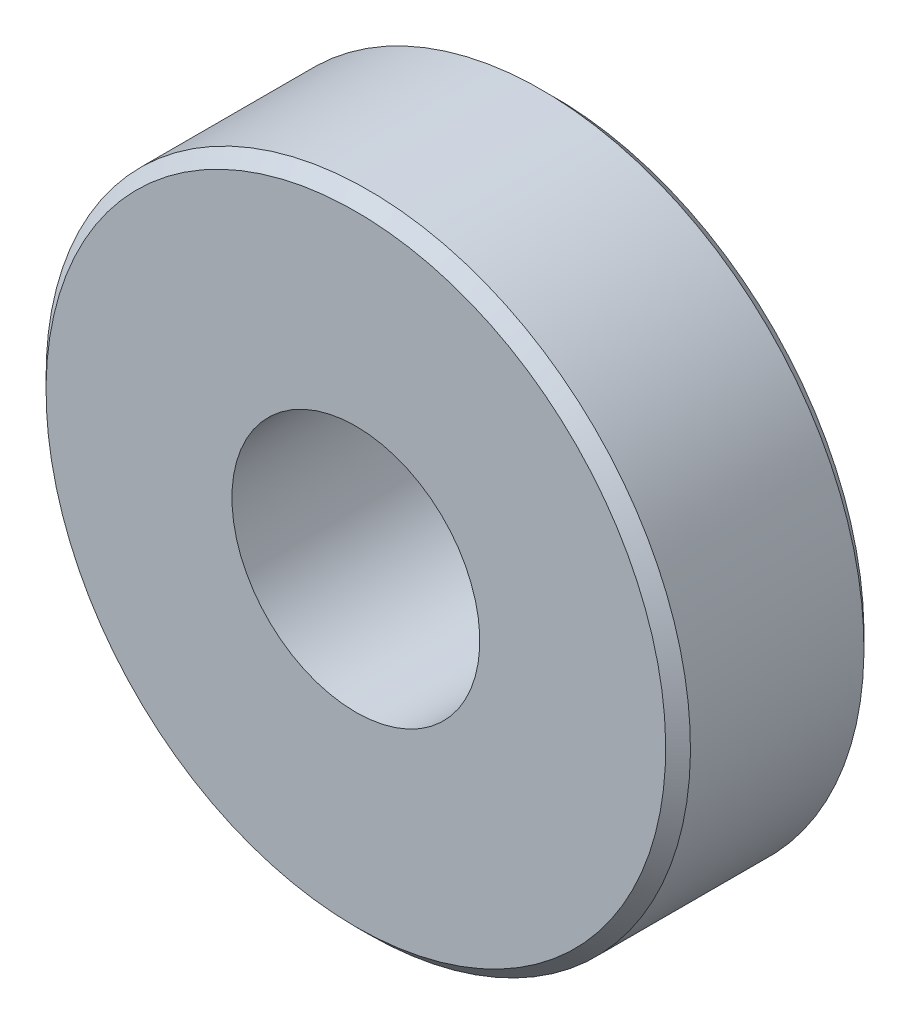
ISO-10303-21;
HEADER;
FILE_DESCRIPTION(('STEP AP214'),'2;1');
FILE_NAME('part.step','',(''),(''),'','','');
FILE_SCHEMA(('AUTOMOTIVE_DESIGN { 1 0 10303 214 1 1 1 1 }'));
ENDSEC;
DATA;
#1=APPLICATION_CONTEXT('core data for automotive mechanical design processes');
#2=APPLICATION_PROTOCOL_DEFINITION('international standard','automotive_design',2000,#1);
#3=PRODUCT_CONTEXT('',#1,'mechanical');
#4=PRODUCT('Part','Part','',(#3));
#5=PRODUCT_RELATED_PRODUCT_CATEGORY('part','',(#4));
#6=PRODUCT_DEFINITION_FORMATION('','',#4);
#7=PRODUCT_DEFINITION_CONTEXT('part definition',#1,'design');
#8=PRODUCT_DEFINITION('design','',#6,#7);
#9=PRODUCT_DEFINITION_SHAPE('','',#8);
#10=(LENGTH_UNIT() NAMED_UNIT(*) SI_UNIT(.MILLI.,.METRE.));
#11=(NAMED_UNIT(*) PLANE_ANGLE_UNIT() SI_UNIT($,.RADIAN.));
#12=(NAMED_UNIT(*) SI_UNIT($,.STERADIAN.) SOLID_ANGLE_UNIT());
#13=UNCERTAINTY_MEASURE_WITH_UNIT(LENGTH_MEASURE(1.E-05),#10,'distance_accuracy_value','');
#14=(GEOMETRIC_REPRESENTATION_CONTEXT(3) GLOBAL_UNCERTAINTY_ASSIGNED_CONTEXT((#13)) GLOBAL_UNIT_ASSIGNED_CONTEXT((#10,
#11,#12)) REPRESENTATION_CONTEXT('',''));
#15=CARTESIAN_POINT('',(0.,0.,0.));
#16=DIRECTION('',(0.,0.,1.));
#17=DIRECTION('',(1.,0.,0.));
#18=AXIS2_PLACEMENT_3D('',#15,#16,#17);
#19=CARTESIAN_POINT('',(-0.0195470693560484,0.0021960919807713,225.792271057495));
#20=DIRECTION('',(0.,0.,1.));
#21=DIRECTION('',(0.,-1.,0.));
#22=AXIS2_PLACEMENT_3D('',#19,#20,#21);
#23=CYLINDRICAL_SURFACE('',#22,13.);
#24=CARTESIAN_POINT('',(-0.0195470693560484,0.0021960919807713,226.292271057495));
#25=DIRECTION('',(0.,0.,1.));
#26=DIRECTION('',(0.,-1.,0.));
#27=AXIS2_PLACEMENT_3D('',#24,#25,#26);
#28=CIRCLE('',#27,13.);
#29=CARTESIAN_POINT('',(-0.0195470693560484,-12.9978039080192,226.292271057495));
#30=VERTEX_POINT('',#29);
#31=EDGE_CURVE('E11',#30,#30,#28,.T.);
#32=ORIENTED_EDGE('',*,*,#31,.T.);
#33=EDGE_LOOP('',(#32));
#34=FACE_BOUND('',#33,.T.);
#35=CARTESIAN_POINT('',(-0.0195470693560484,0.0021960919807713,233.292271057495));
#36=DIRECTION('',(0.,0.,-1.));
#37=DIRECTION('',(0.,-1.,0.));
#38=AXIS2_PLACEMENT_3D('',#35,#36,#37);
#39=CIRCLE('',#38,13.);
#40=CARTESIAN_POINT('',(-0.0195470693560484,-12.9978039080192,233.292271057495));
#41=VERTEX_POINT('',#40);
#42=EDGE_CURVE('E27',#41,#41,#39,.T.);
#43=ORIENTED_EDGE('',*,*,#42,.T.);
#44=EDGE_LOOP('',(#43));
#45=FACE_BOUND('',#44,.T.);
#46=ADVANCED_FACE('F17',(#34,#45),#23,.T.);
#47=CARTESIAN_POINT('',(-0.0195470693560484,0.0021960919807713,225.792271057495));
#48=DIRECTION('',(0.,0.,1.));
#49=DIRECTION('',(0.,-1.,0.));
#50=AXIS2_PLACEMENT_3D('',#47,#48,#49);
#51=CYLINDRICAL_SURFACE('',#50,5.);
#52=CARTESIAN_POINT('',(-0.0195470693560484,0.0021960919807713,225.792271057495));
#53=DIRECTION('',(0.,0.,1.));
#54=DIRECTION('',(0.,-1.,0.));
#55=AXIS2_PLACEMENT_3D('',#52,#53,#54);
#56=CIRCLE('',#55,5.);
#57=CARTESIAN_POINT('',(-0.0195470693560484,-4.99780390801923,225.792271057495));
#58=VERTEX_POINT('',#57);
#59=EDGE_CURVE('E50',#58,#58,#56,.T.);
#60=ORIENTED_EDGE('',*,*,#59,.F.);
#61=EDGE_LOOP('',(#60));
#62=FACE_BOUND('',#61,.T.);
#63=CARTESIAN_POINT('',(-0.0195470693560484,0.0021960919807713,233.792271057495));
#64=DIRECTION('',(0.,0.,1.));
#65=DIRECTION('',(0.,-1.,0.));
#66=AXIS2_PLACEMENT_3D('',#63,#64,#65);
#67=CIRCLE('',#66,5.);
#68=CARTESIAN_POINT('',(-0.0195470693560484,-4.99780390801923,233.792271057495));
#69=VERTEX_POINT('',#68);
#70=EDGE_CURVE('E54',#69,#69,#67,.T.);
#71=ORIENTED_EDGE('',*,*,#70,.T.);
#72=EDGE_LOOP('',(#71));
#73=FACE_BOUND('',#72,.T.);
#74=ADVANCED_FACE('F70',(#62,#73),#51,.F.);
#75=CARTESIAN_POINT('',(-0.0195470693560484,0.0021960919807713,225.792271057495));
#76=DIRECTION('',(0.,0.,1.));
#77=DIRECTION('',(0.,-1.,0.));
#78=AXIS2_PLACEMENT_3D('',#75,#76,#77);
#79=PLANE('',#78);
#80=CARTESIAN_POINT('',(-0.0195470693560484,0.0021960919807713,225.792271057495));
#81=DIRECTION('',(0.,0.,-1.));
#82=DIRECTION('',(0.,-1.,0.));
#83=AXIS2_PLACEMENT_3D('',#80,#81,#82);
#84=CIRCLE('',#83,12.5);
#85=CARTESIAN_POINT('',(-0.0195470693560484,-12.4978039080192,225.792271057495));
#86=VERTEX_POINT('',#85);
#87=EDGE_CURVE('E45',#86,#86,#84,.T.);
#88=ORIENTED_EDGE('',*,*,#87,.T.);
#89=EDGE_LOOP('',(#88));
#90=FACE_BOUND('',#89,.T.);
#91=ORIENTED_EDGE('',*,*,#59,.T.);
#92=EDGE_LOOP('',(#91));
#93=FACE_BOUND('',#92,.T.);
#94=ADVANCED_FACE('F76',(#90,#93),#79,.F.);
#95=CARTESIAN_POINT('',(-0.0195470693560484,0.0021960919807713,233.792271057495));
#96=DIRECTION('',(0.,0.,1.));
#97=DIRECTION('',(0.,-1.,0.));
#98=AXIS2_PLACEMENT_3D('',#95,#96,#97);
#99=PLANE('',#98);
#100=CARTESIAN_POINT('',(-0.0195470693560484,0.0021960919807713,233.792271057495));
#101=DIRECTION('',(0.,0.,1.));
#102=DIRECTION('',(0.,-1.,0.));
#103=AXIS2_PLACEMENT_3D('',#100,#101,#102);
#104=CIRCLE('',#103,12.5);
#105=CARTESIAN_POINT('',(-0.0195470693560484,-12.4978039080192,233.792271057495));
#106=VERTEX_POINT('',#105);
#107=EDGE_CURVE('E21',#106,#106,#104,.T.);
#108=ORIENTED_EDGE('',*,*,#107,.T.);
#109=EDGE_LOOP('',(#108));
#110=FACE_BOUND('',#109,.T.);
#111=ORIENTED_EDGE('',*,*,#70,.F.);
#112=EDGE_LOOP('',(#111));
#113=FACE_BOUND('',#112,.T.);
#114=ADVANCED_FACE('F68',(#110,#113),#99,.T.);
#115=CARTESIAN_POINT('',(-0.0195470693560484,0.0021960919807713,226.292271057495));
#116=DIRECTION('',(0.,0.,1.));
#117=DIRECTION('',(0.,1.,0.));
#118=AXIS2_PLACEMENT_3D('',#115,#116,#117);
#119=CONICAL_SURFACE('',#118,13.,0.785398163397448);
#120=ORIENTED_EDGE('',*,*,#87,.F.);
#121=EDGE_LOOP('',(#120));
#122=FACE_BOUND('',#121,.T.);
#123=ORIENTED_EDGE('',*,*,#31,.F.);
#124=EDGE_LOOP('',(#123));
#125=FACE_BOUND('',#124,.T.);
#126=ADVANCED_FACE('F63',(#122,#125),#119,.T.);
#127=CARTESIAN_POINT('',(-0.0195470693560484,0.0021960919807713,233.792271057495));
#128=DIRECTION('',(0.,0.,-1.));
#129=DIRECTION('',(0.,-1.,0.));
#130=AXIS2_PLACEMENT_3D('',#127,#128,#129);
#131=CONICAL_SURFACE('',#130,12.5,0.785398163397448);
#132=ORIENTED_EDGE('',*,*,#42,.F.);
#133=EDGE_LOOP('',(#132));
#134=FACE_BOUND('',#133,.T.);
#135=ORIENTED_EDGE('',*,*,#107,.F.);
#136=EDGE_LOOP('',(#135));
#137=FACE_BOUND('',#136,.T.);
#138=ADVANCED_FACE('F19',(#134,#137),#131,.T.);
#139=CLOSED_SHELL('',(#46,#74,#94,#114,#126,#138));
#140=MANIFOLD_SOLID_BREP('B1',#139);
#141=ADVANCED_BREP_SHAPE_REPRESENTATION('',(#18,#140),#14);
#142=SHAPE_DEFINITION_REPRESENTATION(#9,#141);
ENDSEC;
END-ISO-10303-21;
